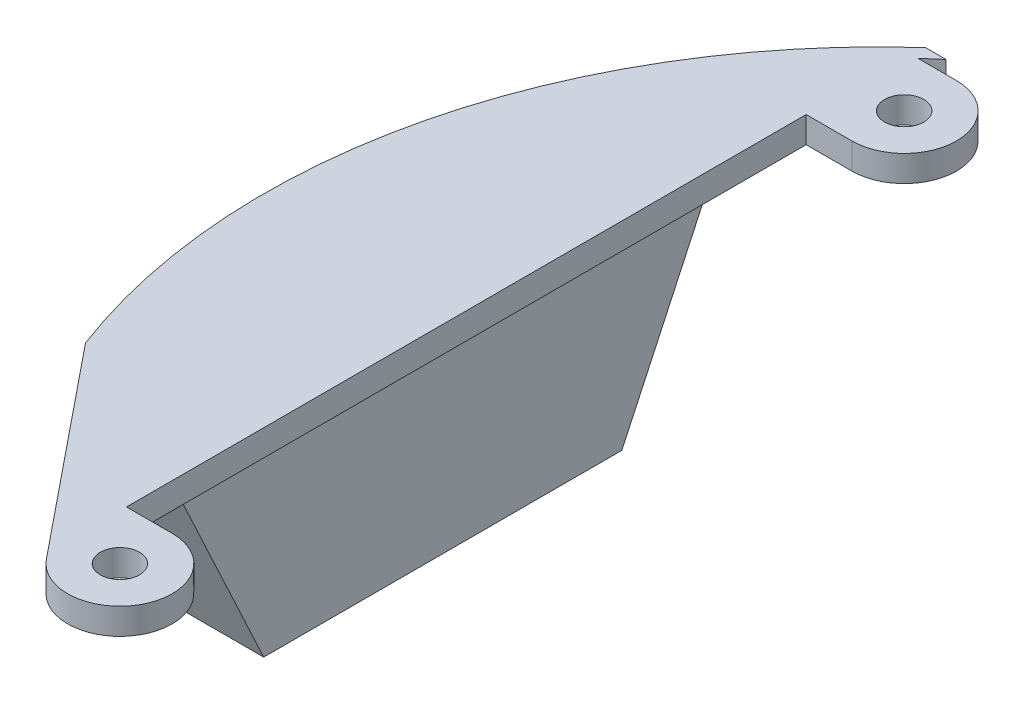
ISO-10303-21;
HEADER;
FILE_DESCRIPTION(('STEP AP214'),'2;1');
FILE_NAME('part.step','',(''),(''),'','','');
FILE_SCHEMA(('AUTOMOTIVE_DESIGN { 1 0 10303 214 1 1 1 1 }'));
ENDSEC;
DATA;
#1=APPLICATION_CONTEXT('core data for automotive mechanical design processes');
#2=APPLICATION_PROTOCOL_DEFINITION('international standard','automotive_design',2000,#1);
#3=PRODUCT_CONTEXT('',#1,'mechanical');
#4=PRODUCT('Part','Part','',(#3));
#5=PRODUCT_RELATED_PRODUCT_CATEGORY('part','',(#4));
#6=PRODUCT_DEFINITION_FORMATION('','',#4);
#7=PRODUCT_DEFINITION_CONTEXT('part definition',#1,'design');
#8=PRODUCT_DEFINITION('design','',#6,#7);
#9=PRODUCT_DEFINITION_SHAPE('','',#8);
#10=(LENGTH_UNIT() NAMED_UNIT(*) SI_UNIT(.MILLI.,.METRE.));
#11=(NAMED_UNIT(*) PLANE_ANGLE_UNIT() SI_UNIT($,.RADIAN.));
#12=(NAMED_UNIT(*) SI_UNIT($,.STERADIAN.) SOLID_ANGLE_UNIT());
#13=UNCERTAINTY_MEASURE_WITH_UNIT(LENGTH_MEASURE(1.E-05),#10,'distance_accuracy_value','');
#14=(GEOMETRIC_REPRESENTATION_CONTEXT(3) GLOBAL_UNCERTAINTY_ASSIGNED_CONTEXT((#13)) GLOBAL_UNIT_ASSIGNED_CONTEXT((#10,
#11,#12)) REPRESENTATION_CONTEXT('',''));
#15=CARTESIAN_POINT('',(0.,0.,0.));
#16=DIRECTION('',(0.,0.,1.));
#17=DIRECTION('',(1.,0.,0.));
#18=AXIS2_PLACEMENT_3D('',#15,#16,#17);
#19=CARTESIAN_POINT('',(0.,0.,0.));
#20=DIRECTION('',(0.,-1.,0.));
#21=DIRECTION('',(0.,0.,-1.));
#22=AXIS2_PLACEMENT_3D('',#19,#20,#21);
#23=PLANE('',#22);
#24=CARTESIAN_POINT('',(0.,0.,30.));
#25=DIRECTION('',(0.,1.,0.));
#26=DIRECTION('',(0.,0.,1.));
#27=AXIS2_PLACEMENT_3D('',#24,#25,#26);
#28=CIRCLE('',#27,1.5);
#29=CARTESIAN_POINT('',(0.,0.,31.5));
#30=VERTEX_POINT('',#29);
#31=EDGE_CURVE('E399',#30,#30,#28,.T.);
#32=ORIENTED_EDGE('',*,*,#31,.T.);
#33=EDGE_LOOP('',(#32));
#34=FACE_BOUND('',#33,.T.);
#35=CARTESIAN_POINT('',(0.,0.,-30.));
#36=DIRECTION('',(0.,1.,0.));
#37=DIRECTION('',(0.,0.,1.));
#38=AXIS2_PLACEMENT_3D('',#35,#36,#37);
#39=CIRCLE('',#38,1.5);
#40=CARTESIAN_POINT('',(0.,0.,-28.5));
#41=VERTEX_POINT('',#40);
#42=EDGE_CURVE('E406',#41,#41,#39,.T.);
#43=ORIENTED_EDGE('',*,*,#42,.T.);
#44=EDGE_LOOP('',(#43));
#45=FACE_BOUND('',#44,.T.);
#46=DIRECTION('',(0.629837318418098,0.,0.77672707711776));
#47=VECTOR('',#46,1.);
#48=CARTESIAN_POINT('',(-17.7832592903084,0.,14.4202007038354));
#49=LINE('',#48,#47);
#50=CARTESIAN_POINT('',(-12.6954230207267,0.,20.6946148723249));
#51=VERTEX_POINT('',#50);
#52=CARTESIAN_POINT('',(-3.10690830847104,0.,32.5193492736724));
#53=VERTEX_POINT('',#52);
#54=EDGE_CURVE('E334',#51,#53,#49,.T.);
#55=ORIENTED_EDGE('',*,*,#54,.F.);
#56=DIRECTION('',(1.,0.,0.));
#57=VECTOR('',#56,1.);
#58=CARTESIAN_POINT('',(0.,0.,20.6946148723249));
#59=LINE('',#58,#57);
#60=CARTESIAN_POINT('',(-5.29999999999982,0.,20.6946148723249));
#61=VERTEX_POINT('',#60);
#62=EDGE_CURVE('E315',#61,#51,#59,.F.);
#63=ORIENTED_EDGE('',*,*,#62,.F.);
#64=DIRECTION('',(0.,0.,0.999999999999988));
#65=VECTOR('',#64,1.);
#66=CARTESIAN_POINT('',(-5.29999999999982,0.,0.));
#67=LINE('',#66,#65);
#68=CARTESIAN_POINT('',(-5.29999999999982,0.,-20.6946148723248));
#69=VERTEX_POINT('',#68);
#70=EDGE_CURVE('E289',#69,#61,#67,.T.);
#71=ORIENTED_EDGE('',*,*,#70,.F.);
#72=DIRECTION('',(-1.,0.,0.));
#73=VECTOR('',#72,1.);
#74=CARTESIAN_POINT('',(0.,0.,-20.6946148723248));
#75=LINE('',#74,#73);
#76=CARTESIAN_POINT('',(-14.1987312046954,0.,-20.6946148723248));
#77=VERTEX_POINT('',#76);
#78=EDGE_CURVE('E318',#77,#69,#75,.F.);
#79=ORIENTED_EDGE('',*,*,#78,.F.);
#80=CARTESIAN_POINT('',(28.0000000000002,0.,0.));
#81=DIRECTION('',(0.,1.,0.));
#82=DIRECTION('',(0.,0.,1.));
#83=AXIS2_PLACEMENT_3D('',#80,#81,#82);
#84=CIRCLE('',#83,47.);
#85=CARTESIAN_POINT('',(-3.36877428271602,0.,-35.));
#86=VERTEX_POINT('',#85);
#87=EDGE_CURVE('E375',#86,#77,#84,.T.);
#88=ORIENTED_EDGE('',*,*,#87,.F.);
#89=DIRECTION('',(-1.,0.,0.));
#90=VECTOR('',#89,1.);
#91=CARTESIAN_POINT('',(-10.,0.,-35.));
#92=LINE('',#91,#90);
#93=CARTESIAN_POINT('',(-1.80181451100141,0.,-35.));
#94=VERTEX_POINT('',#93);
#95=EDGE_CURVE('E412',#94,#86,#92,.T.);
#96=ORIENTED_EDGE('',*,*,#95,.F.);
#97=CARTESIAN_POINT('',(28.0000000000002,0.,-0.129629629629611));
#98=DIRECTION('',(0.,1.,0.));
#99=DIRECTION('',(0.,0.,1.));
#100=AXIS2_PLACEMENT_3D('',#97,#98,#99);
#101=CIRCLE('',#100,45.8703703703704);
#102=CARTESIAN_POINT('',(-2.93362068832025,0.,-34.));
#103=VERTEX_POINT('',#102);
#104=EDGE_CURVE('E337',#94,#103,#101,.T.);
#105=ORIENTED_EDGE('',*,*,#104,.T.);
#106=DIRECTION('',(-1.,0.,0.));
#107=VECTOR('',#106,1.);
#108=CARTESIAN_POINT('',(0.,0.,-34.));
#109=LINE('',#108,#107);
#110=CARTESIAN_POINT('',(0.,0.,-34.));
#111=VERTEX_POINT('',#110);
#112=EDGE_CURVE('E340',#111,#103,#109,.T.);
#113=ORIENTED_EDGE('',*,*,#112,.F.);
#114=CARTESIAN_POINT('',(0.,0.,-30.));
#115=DIRECTION('',(0.,1.,0.));
#116=DIRECTION('',(0.,0.,1.));
#117=AXIS2_PLACEMENT_3D('',#114,#115,#116);
#118=CIRCLE('',#117,4.);
#119=CARTESIAN_POINT('',(0.,0.,-26.));
#120=VERTEX_POINT('',#119);
#121=EDGE_CURVE('E342',#120,#111,#118,.T.);
#122=ORIENTED_EDGE('',*,*,#121,.F.);
#123=DIRECTION('',(-1.,0.,0.));
#124=VECTOR('',#123,1.);
#125=CARTESIAN_POINT('',(-3.,0.,-26.));
#126=LINE('',#125,#124);
#127=CARTESIAN_POINT('',(-3.5,0.,-26.));
#128=VERTEX_POINT('',#127);
#129=EDGE_CURVE('E390',#120,#128,#126,.T.);
#130=ORIENTED_EDGE('',*,*,#129,.T.);
#131=DIRECTION('',(0.,0.,-1.));
#132=VECTOR('',#131,1.);
#133=CARTESIAN_POINT('',(-3.5,0.,0.));
#134=LINE('',#133,#132);
#135=CARTESIAN_POINT('',(-3.5,0.,26.));
#136=VERTEX_POINT('',#135);
#137=EDGE_CURVE('E381',#136,#128,#134,.T.);
#138=ORIENTED_EDGE('',*,*,#137,.F.);
#139=DIRECTION('',(1.,0.,0.));
#140=VECTOR('',#139,1.);
#141=CARTESIAN_POINT('',(-3.,0.,26.));
#142=LINE('',#141,#140);
#143=CARTESIAN_POINT('',(0.,0.,26.));
#144=VERTEX_POINT('',#143);
#145=EDGE_CURVE('E396',#136,#144,#142,.T.);
#146=ORIENTED_EDGE('',*,*,#145,.T.);
#147=CARTESIAN_POINT('',(0.,0.,30.));
#148=DIRECTION('',(0.,1.,0.));
#149=DIRECTION('',(0.,0.,1.));
#150=AXIS2_PLACEMENT_3D('',#147,#148,#149);
#151=CIRCLE('',#150,4.);
#152=EDGE_CURVE('E331',#144,#53,#151,.F.);
#153=ORIENTED_EDGE('',*,*,#152,.T.);
#154=EDGE_LOOP('',(#55,#63,#71,#79,#88,#96,#105,#113,#122,#130,#138,#146,#153));
#155=FACE_BOUND('',#154,.T.);
#156=ADVANCED_FACE('F128',(#34,#45,#155),#23,.T.);
#157=CARTESIAN_POINT('',(-16.6999999999987,0.,-14.5227407881584));
#158=VERTEX_POINT('',#157);
#159=CARTESIAN_POINT('',(-16.6999999999987,0.,14.5227407881585));
#160=VERTEX_POINT('',#159);
#161=EDGE_CURVE('E371',#158,#160,#84,.T.);
#162=ORIENTED_EDGE('',*,*,#161,.F.);
#163=DIRECTION('',(0.,0.,-0.999999999999988));
#164=VECTOR('',#163,1.);
#165=CARTESIAN_POINT('',(-16.6999999999998,0.,0.));
#166=LINE('',#165,#164);
#167=EDGE_CURVE('E316',#160,#158,#166,.T.);
#168=ORIENTED_EDGE('',*,*,#167,.F.);
#169=EDGE_LOOP('',(#162,#168));
#170=FACE_BOUND('',#169,.T.);
#171=ADVANCED_FACE('F460',(#170),#23,.T.);
#172=CARTESIAN_POINT('',(0.,2.,0.));
#173=DIRECTION('',(0.,-1.,0.));
#174=DIRECTION('',(0.,0.,-1.));
#175=AXIS2_PLACEMENT_3D('',#172,#173,#174);
#176=PLANE('',#175);
#177=CARTESIAN_POINT('',(0.,2.,-30.));
#178=DIRECTION('',(0.,1.,0.));
#179=DIRECTION('',(0.,0.,1.));
#180=AXIS2_PLACEMENT_3D('',#177,#178,#179);
#181=CIRCLE('',#180,1.5);
#182=CARTESIAN_POINT('',(0.,2.,-28.5));
#183=VERTEX_POINT('',#182);
#184=EDGE_CURVE('E409',#183,#183,#181,.T.);
#185=ORIENTED_EDGE('',*,*,#184,.F.);
#186=EDGE_LOOP('',(#185));
#187=FACE_BOUND('',#186,.T.);
#188=CARTESIAN_POINT('',(0.,2.,30.));
#189=DIRECTION('',(0.,1.,0.));
#190=DIRECTION('',(0.,0.,1.));
#191=AXIS2_PLACEMENT_3D('',#188,#189,#190);
#192=CIRCLE('',#191,1.5);
#193=CARTESIAN_POINT('',(0.,2.,31.5));
#194=VERTEX_POINT('',#193);
#195=EDGE_CURVE('E403',#194,#194,#192,.T.);
#196=ORIENTED_EDGE('',*,*,#195,.F.);
#197=EDGE_LOOP('',(#196));
#198=FACE_BOUND('',#197,.T.);
#199=CARTESIAN_POINT('',(28.0000000000002,2.,0.));
#200=DIRECTION('',(0.,1.,0.));
#201=DIRECTION('',(0.,0.,1.));
#202=AXIS2_PLACEMENT_3D('',#199,#200,#201);
#203=CIRCLE('',#202,47.);
#204=CARTESIAN_POINT('',(-3.36877428271602,2.,-35.));
#205=VERTEX_POINT('',#204);
#206=CARTESIAN_POINT('',(-15.9316189320438,2.,16.7036779785075));
#207=VERTEX_POINT('',#206);
#208=EDGE_CURVE('E361',#205,#207,#203,.T.);
#209=ORIENTED_EDGE('',*,*,#208,.T.);
#210=DIRECTION('',(0.629837318418098,0.,0.77672707711776));
#211=VECTOR('',#210,1.);
#212=CARTESIAN_POINT('',(-17.7832592903084,2.,14.4202007038354));
#213=LINE('',#212,#211);
#214=CARTESIAN_POINT('',(-3.10690830847104,2.,32.5193492736724));
#215=VERTEX_POINT('',#214);
#216=EDGE_CURVE('E347',#207,#215,#213,.T.);
#217=ORIENTED_EDGE('',*,*,#216,.T.);
#218=CARTESIAN_POINT('',(0.,2.,30.));
#219=DIRECTION('',(0.,1.,0.));
#220=DIRECTION('',(0.,0.,1.));
#221=AXIS2_PLACEMENT_3D('',#218,#219,#220);
#222=CIRCLE('',#221,4.);
#223=CARTESIAN_POINT('',(0.,2.,26.));
#224=VERTEX_POINT('',#223);
#225=EDGE_CURVE('E329',#224,#215,#222,.F.);
#226=ORIENTED_EDGE('',*,*,#225,.F.);
#227=DIRECTION('',(1.,0.,0.));
#228=VECTOR('',#227,1.);
#229=CARTESIAN_POINT('',(-3.,2.,26.));
#230=LINE('',#229,#228);
#231=CARTESIAN_POINT('',(-3.5,2.,26.));
#232=VERTEX_POINT('',#231);
#233=EDGE_CURVE('E395',#232,#224,#230,.T.);
#234=ORIENTED_EDGE('',*,*,#233,.F.);
#235=DIRECTION('',(0.,0.,-1.));
#236=VECTOR('',#235,1.);
#237=CARTESIAN_POINT('',(-3.5,2.,0.));
#238=LINE('',#237,#236);
#239=CARTESIAN_POINT('',(-3.5,2.,-26.));
#240=VERTEX_POINT('',#239);
#241=EDGE_CURVE('E380',#232,#240,#238,.T.);
#242=ORIENTED_EDGE('',*,*,#241,.T.);
#243=DIRECTION('',(-1.,0.,0.));
#244=VECTOR('',#243,1.);
#245=CARTESIAN_POINT('',(-3.,2.,-26.));
#246=LINE('',#245,#244);
#247=CARTESIAN_POINT('',(0.,2.,-26.));
#248=VERTEX_POINT('',#247);
#249=EDGE_CURVE('E393',#248,#240,#246,.T.);
#250=ORIENTED_EDGE('',*,*,#249,.F.);
#251=CARTESIAN_POINT('',(0.,2.,-30.));
#252=DIRECTION('',(0.,1.,0.));
#253=DIRECTION('',(0.,0.,1.));
#254=AXIS2_PLACEMENT_3D('',#251,#252,#253);
#255=CIRCLE('',#254,4.);
#256=CARTESIAN_POINT('',(0.,2.,-34.));
#257=VERTEX_POINT('',#256);
#258=EDGE_CURVE('E335',#248,#257,#255,.T.);
#259=ORIENTED_EDGE('',*,*,#258,.T.);
#260=DIRECTION('',(-1.,0.,0.));
#261=VECTOR('',#260,1.);
#262=CARTESIAN_POINT('',(0.,2.,-34.));
#263=LINE('',#262,#261);
#264=CARTESIAN_POINT('',(-2.93362068832025,2.,-34.));
#265=VERTEX_POINT('',#264);
#266=EDGE_CURVE('E353',#257,#265,#263,.T.);
#267=ORIENTED_EDGE('',*,*,#266,.T.);
#268=CARTESIAN_POINT('',(28.0000000000002,2.,-0.129629629629611));
#269=DIRECTION('',(0.,1.,0.));
#270=DIRECTION('',(0.,0.,1.));
#271=AXIS2_PLACEMENT_3D('',#268,#269,#270);
#272=CIRCLE('',#271,45.8703703703704);
#273=CARTESIAN_POINT('',(-1.80181451100141,2.,-35.));
#274=VERTEX_POINT('',#273);
#275=EDGE_CURVE('E350',#274,#265,#272,.T.);
#276=ORIENTED_EDGE('',*,*,#275,.F.);
#277=DIRECTION('',(-1.,0.,0.));
#278=VECTOR('',#277,1.);
#279=CARTESIAN_POINT('',(-10.,2.,-35.));
#280=LINE('',#279,#278);
#281=EDGE_CURVE('E415',#274,#205,#280,.T.);
#282=ORIENTED_EDGE('',*,*,#281,.T.);
#283=EDGE_LOOP('',(#209,#217,#226,#234,#242,#250,#259,#267,#276,#282));
#284=FACE_BOUND('',#283,.T.);
#285=ADVANCED_FACE('F467',(#187,#198,#284),#176,.F.);
#286=CARTESIAN_POINT('',(-10.,2.,-35.));
#287=DIRECTION('',(0.,0.,1.));
#288=DIRECTION('',(1.,0.,0.));
#289=AXIS2_PLACEMENT_3D('',#286,#287,#288);
#290=PLANE('',#289);
#291=DIRECTION('',(0.,1.,0.));
#292=VECTOR('',#291,1.);
#293=CARTESIAN_POINT('',(-3.36877428271602,0.,-35.));
#294=LINE('',#293,#292);
#295=EDGE_CURVE('E374',#86,#205,#294,.T.);
#296=ORIENTED_EDGE('',*,*,#295,.T.);
#297=ORIENTED_EDGE('',*,*,#281,.F.);
#298=DIRECTION('',(0.,1.,0.));
#299=VECTOR('',#298,1.);
#300=CARTESIAN_POINT('',(-1.80181451100141,0.,-35.));
#301=LINE('',#300,#299);
#302=EDGE_CURVE('E366',#94,#274,#301,.T.);
#303=ORIENTED_EDGE('',*,*,#302,.F.);
#304=ORIENTED_EDGE('',*,*,#95,.T.);
#305=EDGE_LOOP('',(#296,#297,#303,#304));
#306=FACE_BOUND('',#305,.T.);
#307=ADVANCED_FACE('F528',(#306),#290,.F.);
#308=CARTESIAN_POINT('',(-3.,2.,-26.));
#309=DIRECTION('',(0.,0.,1.));
#310=DIRECTION('',(1.,0.,0.));
#311=AXIS2_PLACEMENT_3D('',#308,#309,#310);
#312=PLANE('',#311);
#313=ORIENTED_EDGE('',*,*,#129,.F.);
#314=DIRECTION('',(0.,1.,0.));
#315=VECTOR('',#314,1.);
#316=CARTESIAN_POINT('',(0.,0.,-26.));
#317=LINE('',#316,#315);
#318=EDGE_CURVE('E358',#120,#248,#317,.T.);
#319=ORIENTED_EDGE('',*,*,#318,.T.);
#320=ORIENTED_EDGE('',*,*,#249,.T.);
#321=DIRECTION('',(0.,1.,0.));
#322=VECTOR('',#321,1.);
#323=CARTESIAN_POINT('',(-3.5,0.,-26.));
#324=LINE('',#323,#322);
#325=EDGE_CURVE('E384',#128,#240,#324,.T.);
#326=ORIENTED_EDGE('',*,*,#325,.F.);
#327=EDGE_LOOP('',(#313,#319,#320,#326));
#328=FACE_BOUND('',#327,.T.);
#329=ADVANCED_FACE('F524',(#328),#312,.T.);
#330=CARTESIAN_POINT('',(-3.,2.,26.));
#331=DIRECTION('',(0.,0.,-1.));
#332=DIRECTION('',(-1.,0.,0.));
#333=AXIS2_PLACEMENT_3D('',#330,#331,#332);
#334=PLANE('',#333);
#335=ORIENTED_EDGE('',*,*,#233,.T.);
#336=DIRECTION('',(0.,1.,0.));
#337=VECTOR('',#336,1.);
#338=CARTESIAN_POINT('',(0.,0.,26.));
#339=LINE('',#338,#337);
#340=EDGE_CURVE('E344',#144,#224,#339,.T.);
#341=ORIENTED_EDGE('',*,*,#340,.F.);
#342=ORIENTED_EDGE('',*,*,#145,.F.);
#343=DIRECTION('',(0.,1.,0.));
#344=VECTOR('',#343,1.);
#345=CARTESIAN_POINT('',(-3.5,0.,26.));
#346=LINE('',#345,#344);
#347=EDGE_CURVE('E387',#136,#232,#346,.T.);
#348=ORIENTED_EDGE('',*,*,#347,.T.);
#349=EDGE_LOOP('',(#335,#341,#342,#348));
#350=FACE_BOUND('',#349,.T.);
#351=ADVANCED_FACE('F520',(#350),#334,.T.);
#352=CARTESIAN_POINT('',(0.,2.,-30.));
#353=DIRECTION('',(0.,-1.,0.));
#354=DIRECTION('',(0.,0.,-1.));
#355=AXIS2_PLACEMENT_3D('',#352,#353,#354);
#356=CYLINDRICAL_SURFACE('',#355,1.5);
#357=ORIENTED_EDGE('',*,*,#184,.T.);
#358=EDGE_LOOP('',(#357));
#359=FACE_BOUND('',#358,.T.);
#360=ORIENTED_EDGE('',*,*,#42,.F.);
#361=EDGE_LOOP('',(#360));
#362=FACE_BOUND('',#361,.T.);
#363=ADVANCED_FACE('F523',(#359,#362),#356,.F.);
#364=CARTESIAN_POINT('',(0.,2.,30.));
#365=DIRECTION('',(0.,-1.,0.));
#366=DIRECTION('',(0.,0.,-1.));
#367=AXIS2_PLACEMENT_3D('',#364,#365,#366);
#368=CYLINDRICAL_SURFACE('',#367,1.5);
#369=ORIENTED_EDGE('',*,*,#195,.T.);
#370=EDGE_LOOP('',(#369));
#371=FACE_BOUND('',#370,.T.);
#372=ORIENTED_EDGE('',*,*,#31,.F.);
#373=EDGE_LOOP('',(#372));
#374=FACE_BOUND('',#373,.T.);
#375=ADVANCED_FACE('F518',(#371,#374),#368,.F.);
#376=CARTESIAN_POINT('',(-3.5,0.,0.));
#377=DIRECTION('',(1.,0.,0.));
#378=DIRECTION('',(0.,0.,-1.));
#379=AXIS2_PLACEMENT_3D('',#376,#377,#378);
#380=PLANE('',#379);
#381=ORIENTED_EDGE('',*,*,#241,.F.);
#382=ORIENTED_EDGE('',*,*,#347,.F.);
#383=ORIENTED_EDGE('',*,*,#137,.T.);
#384=ORIENTED_EDGE('',*,*,#325,.T.);
#385=EDGE_LOOP('',(#381,#382,#383,#384));
#386=FACE_BOUND('',#385,.T.);
#387=ADVANCED_FACE('F513',(#386),#380,.T.);
#388=CARTESIAN_POINT('',(0.,0.,30.));
#389=DIRECTION('',(0.,1.,0.));
#390=DIRECTION('',(0.,0.,1.));
#391=AXIS2_PLACEMENT_3D('',#388,#389,#390);
#392=CYLINDRICAL_SURFACE('',#391,4.);
#393=ORIENTED_EDGE('',*,*,#225,.T.);
#394=DIRECTION('',(0.,1.,0.));
#395=VECTOR('',#394,1.);
#396=CARTESIAN_POINT('',(-3.10690830847104,0.,32.5193492736724));
#397=LINE('',#396,#395);
#398=EDGE_CURVE('E368',#53,#215,#397,.T.);
#399=ORIENTED_EDGE('',*,*,#398,.F.);
#400=ORIENTED_EDGE('',*,*,#152,.F.);
#401=ORIENTED_EDGE('',*,*,#340,.T.);
#402=EDGE_LOOP('',(#393,#399,#400,#401));
#403=FACE_BOUND('',#402,.T.);
#404=ADVANCED_FACE('F510',(#403),#392,.T.);
#405=CARTESIAN_POINT('',(-17.7832592903084,0.,14.4202007038354));
#406=DIRECTION('',(-0.77672707711776,0.,0.629837318418098));
#407=DIRECTION('',(0.629837318418098,0.,0.77672707711776));
#408=AXIS2_PLACEMENT_3D('',#405,#406,#407);
#409=PLANE('',#408);
#410=ORIENTED_EDGE('',*,*,#216,.F.);
#411=DIRECTION('',(0.,1.,0.));
#412=VECTOR('',#411,1.);
#413=CARTESIAN_POINT('',(-15.9316189320438,0.,16.7036779785075));
#414=LINE('',#413,#412);
#415=CARTESIAN_POINT('',(-15.9316189320438,-8.55859178810817,16.7036779785075));
#416=VERTEX_POINT('',#415);
#417=EDGE_CURVE('E326',#416,#207,#414,.T.);
#418=ORIENTED_EDGE('',*,*,#417,.F.);
#419=DIRECTION('',(0.324187360010223,0.857360726366758,0.399793872506155));
#420=VECTOR('',#419,1.);
#421=CARTESIAN_POINT('',(-14.0433566350928,-3.56480691496023,19.032318108035));
#422=LINE('',#421,#420);
#423=EDGE_CURVE('E418',#51,#416,#422,.F.);
#424=ORIENTED_EDGE('',*,*,#423,.F.);
#425=ORIENTED_EDGE('',*,*,#54,.T.);
#426=ORIENTED_EDGE('',*,*,#398,.T.);
#427=EDGE_LOOP('',(#410,#418,#424,#425,#426));
#428=FACE_BOUND('',#427,.T.);
#429=ADVANCED_FACE('F500',(#428),#409,.T.);
#430=CARTESIAN_POINT('',(0.,0.,-30.));
#431=DIRECTION('',(0.,1.,0.));
#432=DIRECTION('',(0.,0.,1.));
#433=AXIS2_PLACEMENT_3D('',#430,#431,#432);
#434=CYLINDRICAL_SURFACE('',#433,4.);
#435=ORIENTED_EDGE('',*,*,#258,.F.);
#436=ORIENTED_EDGE('',*,*,#318,.F.);
#437=ORIENTED_EDGE('',*,*,#121,.T.);
#438=DIRECTION('',(0.,1.,0.));
#439=VECTOR('',#438,1.);
#440=CARTESIAN_POINT('',(0.,0.,-34.));
#441=LINE('',#440,#439);
#442=EDGE_CURVE('E362',#111,#257,#441,.T.);
#443=ORIENTED_EDGE('',*,*,#442,.T.);
#444=EDGE_LOOP('',(#435,#436,#437,#443));
#445=FACE_BOUND('',#444,.T.);
#446=ADVANCED_FACE('F496',(#445),#434,.T.);
#447=CARTESIAN_POINT('',(0.,0.,-34.));
#448=DIRECTION('',(0.,0.,-1.));
#449=DIRECTION('',(-1.,0.,0.));
#450=AXIS2_PLACEMENT_3D('',#447,#448,#449);
#451=PLANE('',#450);
#452=ORIENTED_EDGE('',*,*,#266,.F.);
#453=ORIENTED_EDGE('',*,*,#442,.F.);
#454=ORIENTED_EDGE('',*,*,#112,.T.);
#455=DIRECTION('',(0.,1.,0.));
#456=VECTOR('',#455,1.);
#457=CARTESIAN_POINT('',(-2.93362068832025,0.,-34.));
#458=LINE('',#457,#456);
#459=EDGE_CURVE('E364',#103,#265,#458,.T.);
#460=ORIENTED_EDGE('',*,*,#459,.T.);
#461=EDGE_LOOP('',(#452,#453,#454,#460));
#462=FACE_BOUND('',#461,.T.);
#463=ADVANCED_FACE('F499',(#462),#451,.T.);
#464=CARTESIAN_POINT('',(28.0000000000002,0.,-0.129629629629611));
#465=DIRECTION('',(0.,1.,0.));
#466=DIRECTION('',(0.,0.,1.));
#467=AXIS2_PLACEMENT_3D('',#464,#465,#466);
#468=CYLINDRICAL_SURFACE('',#467,45.8703703703704);
#469=ORIENTED_EDGE('',*,*,#275,.T.);
#470=ORIENTED_EDGE('',*,*,#459,.F.);
#471=ORIENTED_EDGE('',*,*,#104,.F.);
#472=ORIENTED_EDGE('',*,*,#302,.T.);
#473=EDGE_LOOP('',(#469,#470,#471,#472));
#474=FACE_BOUND('',#473,.T.);
#475=ADVANCED_FACE('F457',(#474),#468,.F.);
#476=CARTESIAN_POINT('',(28.0000000000002,0.,0.));
#477=DIRECTION('',(0.,1.,0.));
#478=DIRECTION('',(0.,0.,1.));
#479=AXIS2_PLACEMENT_3D('',#476,#477,#478);
#480=CYLINDRICAL_SURFACE('',#479,47.);
#481=ORIENTED_EDGE('',*,*,#208,.F.);
#482=ORIENTED_EDGE('',*,*,#295,.F.);
#483=ORIENTED_EDGE('',*,*,#87,.T.);
#484=CARTESIAN_POINT('',(28.0000000000002,-44.3797448109803,0.));
#485=DIRECTION('',(0.,-0.4226182617407,-0.906307787036644));
#486=DIRECTION('',(0.,0.906307787036649,-0.422618261740702));
#487=AXIS2_PLACEMENT_3D('',#484,#485,#486);
#488=ELLIPSE('',#487,111.211474408167,47.);
#489=CARTESIAN_POINT('',(-16.6999999999998,-13.2356266860101,-14.5227407881576));
#490=VERTEX_POINT('',#489);
#491=EDGE_CURVE('E136',#77,#490,#488,.F.);
#492=ORIENTED_EDGE('',*,*,#491,.T.);
#493=DIRECTION('',(0.,1.,0.));
#494=VECTOR('',#493,1.);
#495=CARTESIAN_POINT('',(-16.6999999999998,0.,-14.522740788157));
#496=LINE('',#495,#494);
#497=EDGE_CURVE('E12',#158,#490,#496,.F.);
#498=ORIENTED_EDGE('',*,*,#497,.F.);
#499=ORIENTED_EDGE('',*,*,#161,.T.);
#500=DIRECTION('',(0.,1.,0.));
#501=VECTOR('',#500,1.);
#502=CARTESIAN_POINT('',(-16.6999999999998,0.,14.522740788157));
#503=LINE('',#502,#501);
#504=CARTESIAN_POINT('',(-16.6999999999998,-13.2356266860114,14.522740788157));
#505=VERTEX_POINT('',#504);
#506=EDGE_CURVE('E435',#160,#505,#503,.F.);
#507=ORIENTED_EDGE('',*,*,#506,.T.);
#508=CARTESIAN_POINT('',(28.0000000000002,-44.3797448109803,0.));
#509=DIRECTION('',(0.,-0.4226182617407,0.906307787036644));
#510=DIRECTION('',(0.,0.906307787036649,0.422618261740702));
#511=AXIS2_PLACEMENT_3D('',#508,#509,#510);
#512=ELLIPSE('',#511,111.211474408167,47.);
#513=EDGE_CURVE('E149',#416,#505,#512,.T.);
#514=ORIENTED_EDGE('',*,*,#513,.F.);
#515=ORIENTED_EDGE('',*,*,#417,.T.);
#516=EDGE_LOOP('',(#481,#482,#483,#492,#498,#499,#507,#514,#515));
#517=FACE_BOUND('',#516,.T.);
#518=ADVANCED_FACE('F439',(#517),#480,.T.);
#519=CARTESIAN_POINT('',(0.,-15.,13.6999999999998));
#520=DIRECTION('',(0.,-0.4226182617407,0.906307787036644));
#521=DIRECTION('',(0.,-0.906307787036649,-0.422618261740702));
#522=AXIS2_PLACEMENT_3D('',#519,#520,#521);
#523=PLANE('',#522);
#524=ORIENTED_EDGE('',*,*,#513,.T.);
#525=DIRECTION('',(0.,-0.906307787036649,-0.422618261740702));
#526=VECTOR('',#525,1.);
#527=CARTESIAN_POINT('',(-16.6999999999998,-20.247404435365,11.2530951263526));
#528=LINE('',#527,#526);
#529=CARTESIAN_POINT('',(-16.6999999999998,-15.,13.6999999999998));
#530=VERTEX_POINT('',#529);
#531=EDGE_CURVE('E330',#530,#505,#528,.F.);
#532=ORIENTED_EDGE('',*,*,#531,.F.);
#533=DIRECTION('',(-0.999999999999994,0.,0.));
#534=VECTOR('',#533,1.);
#535=CARTESIAN_POINT('',(0.,-15.,13.6999999999998));
#536=LINE('',#535,#534);
#537=CARTESIAN_POINT('',(-5.29999999999999,-15.,13.6999999999999));
#538=VERTEX_POINT('',#537);
#539=EDGE_CURVE('E298',#538,#530,#536,.T.);
#540=ORIENTED_EDGE('',*,*,#539,.F.);
#541=DIRECTION('',(0.,-0.906307787036649,-0.422618261740702));
#542=VECTOR('',#541,1.);
#543=CARTESIAN_POINT('',(-5.29999999999982,-15.,13.6999999999998));
#544=LINE('',#543,#542);
#545=EDGE_CURVE('E277',#538,#61,#544,.F.);
#546=ORIENTED_EDGE('',*,*,#545,.T.);
#547=ORIENTED_EDGE('',*,*,#62,.T.);
#548=ORIENTED_EDGE('',*,*,#423,.T.);
#549=EDGE_LOOP('',(#524,#532,#540,#546,#547,#548));
#550=FACE_BOUND('',#549,.T.);
#551=ADVANCED_FACE('F130',(#550),#523,.T.);
#552=CARTESIAN_POINT('',(-16.6999999999998,-15.,0.));
#553=DIRECTION('',(1.,0.,0.));
#554=DIRECTION('',(0.,0.,-1.));
#555=AXIS2_PLACEMENT_3D('',#552,#553,#554);
#556=PLANE('',#555);
#557=ORIENTED_EDGE('',*,*,#167,.T.);
#558=ORIENTED_EDGE('',*,*,#497,.T.);
#559=DIRECTION('',(0.,-0.906307787036649,0.422618261740702));
#560=VECTOR('',#559,1.);
#561=CARTESIAN_POINT('',(-16.6999999999998,-15.,-13.6999999999998));
#562=LINE('',#561,#560);
#563=CARTESIAN_POINT('',(-16.6999999999998,-15.,-13.6999999999998));
#564=VERTEX_POINT('',#563);
#565=EDGE_CURVE('E423',#564,#490,#562,.F.);
#566=ORIENTED_EDGE('',*,*,#565,.F.);
#567=DIRECTION('',(0.,0.,-0.999999999999988));
#568=VECTOR('',#567,1.);
#569=CARTESIAN_POINT('',(-16.6999999999998,-15.,0.));
#570=LINE('',#569,#568);
#571=EDGE_CURVE('E301',#530,#564,#570,.T.);
#572=ORIENTED_EDGE('',*,*,#571,.F.);
#573=ORIENTED_EDGE('',*,*,#531,.T.);
#574=ORIENTED_EDGE('',*,*,#506,.F.);
#575=EDGE_LOOP('',(#557,#558,#566,#572,#573,#574));
#576=FACE_BOUND('',#575,.T.);
#577=ADVANCED_FACE('F446',(#576),#556,.F.);
#578=CARTESIAN_POINT('',(0.,-15.,-13.6999999999998));
#579=DIRECTION('',(0.,-0.4226182617407,-0.906307787036644));
#580=DIRECTION('',(0.,0.906307787036649,-0.422618261740702));
#581=AXIS2_PLACEMENT_3D('',#578,#579,#580);
#582=PLANE('',#581);
#583=ORIENTED_EDGE('',*,*,#78,.T.);
#584=DIRECTION('',(0.,-0.906307787036649,0.422618261740702));
#585=VECTOR('',#584,1.);
#586=CARTESIAN_POINT('',(-5.29999999999982,-20.2474044353649,-11.2530951263526));
#587=LINE('',#586,#585);
#588=CARTESIAN_POINT('',(-5.29999999999982,-15.,-13.6999999999997));
#589=VERTEX_POINT('',#588);
#590=EDGE_CURVE('E426',#589,#69,#587,.F.);
#591=ORIENTED_EDGE('',*,*,#590,.F.);
#592=DIRECTION('',(0.999999999999994,0.,0.));
#593=VECTOR('',#592,1.);
#594=CARTESIAN_POINT('',(0.,-15.,-13.6999999999998));
#595=LINE('',#594,#593);
#596=EDGE_CURVE('E303',#564,#589,#595,.T.);
#597=ORIENTED_EDGE('',*,*,#596,.F.);
#598=ORIENTED_EDGE('',*,*,#565,.T.);
#599=ORIENTED_EDGE('',*,*,#491,.F.);
#600=EDGE_LOOP('',(#583,#591,#597,#598,#599));
#601=FACE_BOUND('',#600,.T.);
#602=ADVANCED_FACE('F444',(#601),#582,.T.);
#603=CARTESIAN_POINT('',(0.,-15.,12.4999999999998));
#604=DIRECTION('',(0.,0.,-1.));
#605=DIRECTION('',(-1.,0.,0.));
#606=AXIS2_PLACEMENT_3D('',#603,#604,#605);
#607=PLANE('',#606);
#608=DIRECTION('',(-0.999999999999994,0.,0.));
#609=VECTOR('',#608,1.);
#610=CARTESIAN_POINT('',(0.,0.,12.4999999999998));
#611=LINE('',#610,#609);
#612=CARTESIAN_POINT('',(-6.49999999999982,0.,12.4999999999999));
#613=VERTEX_POINT('',#612);
#614=CARTESIAN_POINT('',(-15.5,0.,12.4999999999998));
#615=VERTEX_POINT('',#614);
#616=EDGE_CURVE('E273',#613,#615,#611,.T.);
#617=ORIENTED_EDGE('',*,*,#616,.F.);
#618=DIRECTION('',(0.,1.,0.));
#619=VECTOR('',#618,1.);
#620=CARTESIAN_POINT('',(-6.5,-15.,12.4999999999999));
#621=LINE('',#620,#619);
#622=CARTESIAN_POINT('',(-6.5,-15.,12.4999999999999));
#623=VERTEX_POINT('',#622);
#624=EDGE_CURVE('E267',#623,#613,#621,.T.);
#625=ORIENTED_EDGE('',*,*,#624,.F.);
#626=DIRECTION('',(-0.999999999999994,0.,0.));
#627=VECTOR('',#626,1.);
#628=CARTESIAN_POINT('',(0.,-15.,12.4999999999998));
#629=LINE('',#628,#627);
#630=CARTESIAN_POINT('',(-15.5,-15.,12.4999999999998));
#631=VERTEX_POINT('',#630);
#632=EDGE_CURVE('E271',#623,#631,#629,.T.);
#633=ORIENTED_EDGE('',*,*,#632,.T.);
#634=DIRECTION('',(0.,1.,0.));
#635=VECTOR('',#634,1.);
#636=CARTESIAN_POINT('',(-15.5,-15.,12.4999999999998));
#637=LINE('',#636,#635);
#638=EDGE_CURVE('E307',#631,#615,#637,.T.);
#639=ORIENTED_EDGE('',*,*,#638,.T.);
#640=EDGE_LOOP('',(#617,#625,#633,#639));
#641=FACE_BOUND('',#640,.T.);
#642=ADVANCED_FACE('F269',(#641),#607,.T.);
#643=CARTESIAN_POINT('',(-6.49999999999982,-15.,0.));
#644=DIRECTION('',(-1.,0.,0.));
#645=DIRECTION('',(0.,0.,1.));
#646=AXIS2_PLACEMENT_3D('',#643,#644,#645);
#647=PLANE('',#646);
#648=DIRECTION('',(0.,0.,0.999999999999988));
#649=VECTOR('',#648,1.);
#650=CARTESIAN_POINT('',(-6.49999999999982,0.,0.));
#651=LINE('',#650,#649);
#652=CARTESIAN_POINT('',(-6.49999999999982,0.,-12.4999999999998));
#653=VERTEX_POINT('',#652);
#654=EDGE_CURVE('E309',#653,#613,#651,.T.);
#655=ORIENTED_EDGE('',*,*,#654,.F.);
#656=DIRECTION('',(0.,1.,0.));
#657=VECTOR('',#656,1.);
#658=CARTESIAN_POINT('',(-6.49999999999982,-15.,-12.4999999999997));
#659=LINE('',#658,#657);
#660=CARTESIAN_POINT('',(-6.49999999999982,-15.,-12.4999999999997));
#661=VERTEX_POINT('',#660);
#662=EDGE_CURVE('E278',#661,#653,#659,.T.);
#663=ORIENTED_EDGE('',*,*,#662,.F.);
#664=DIRECTION('',(0.,0.,0.999999999999988));
#665=VECTOR('',#664,1.);
#666=CARTESIAN_POINT('',(-6.49999999999982,-15.,0.));
#667=LINE('',#666,#665);
#668=EDGE_CURVE('E285',#661,#623,#667,.T.);
#669=ORIENTED_EDGE('',*,*,#668,.T.);
#670=ORIENTED_EDGE('',*,*,#624,.T.);
#671=EDGE_LOOP('',(#655,#663,#669,#670));
#672=FACE_BOUND('',#671,.T.);
#673=ADVANCED_FACE('F291',(#672),#647,.T.);
#674=CARTESIAN_POINT('',(0.,-15.,-12.4999999999998));
#675=DIRECTION('',(0.,0.,1.));
#676=DIRECTION('',(1.,0.,0.));
#677=AXIS2_PLACEMENT_3D('',#674,#675,#676);
#678=PLANE('',#677);
#679=DIRECTION('',(0.999999999999994,0.,0.));
#680=VECTOR('',#679,1.);
#681=CARTESIAN_POINT('',(0.,0.,-12.4999999999998));
#682=LINE('',#681,#680);
#683=CARTESIAN_POINT('',(-15.4999999999998,0.,-12.4999999999998));
#684=VERTEX_POINT('',#683);
#685=EDGE_CURVE('E311',#684,#653,#682,.T.);
#686=ORIENTED_EDGE('',*,*,#685,.F.);
#687=DIRECTION('',(0.,1.,0.));
#688=VECTOR('',#687,1.);
#689=CARTESIAN_POINT('',(-15.4999999999998,-15.,-12.4999999999998));
#690=LINE('',#689,#688);
#691=CARTESIAN_POINT('',(-15.4999999999998,-15.,-12.4999999999998));
#692=VERTEX_POINT('',#691);
#693=EDGE_CURVE('E322',#692,#684,#690,.T.);
#694=ORIENTED_EDGE('',*,*,#693,.F.);
#695=DIRECTION('',(0.999999999999994,0.,0.));
#696=VECTOR('',#695,1.);
#697=CARTESIAN_POINT('',(0.,-15.,-12.4999999999998));
#698=LINE('',#697,#696);
#699=EDGE_CURVE('E293',#692,#661,#698,.T.);
#700=ORIENTED_EDGE('',*,*,#699,.T.);
#701=ORIENTED_EDGE('',*,*,#662,.T.);
#702=EDGE_LOOP('',(#686,#694,#700,#701));
#703=FACE_BOUND('',#702,.T.);
#704=ADVANCED_FACE('F484',(#703),#678,.T.);
#705=CARTESIAN_POINT('',(-15.4999999999998,-15.,0.));
#706=DIRECTION('',(1.,0.,0.));
#707=DIRECTION('',(0.,0.,-1.));
#708=AXIS2_PLACEMENT_3D('',#705,#706,#707);
#709=PLANE('',#708);
#710=DIRECTION('',(0.,0.,-0.999999999999988));
#711=VECTOR('',#710,1.);
#712=CARTESIAN_POINT('',(-15.4999999999998,0.,0.));
#713=LINE('',#712,#711);
#714=EDGE_CURVE('E313',#615,#684,#713,.T.);
#715=ORIENTED_EDGE('',*,*,#714,.F.);
#716=ORIENTED_EDGE('',*,*,#638,.F.);
#717=DIRECTION('',(0.,0.,-0.999999999999988));
#718=VECTOR('',#717,1.);
#719=CARTESIAN_POINT('',(-15.4999999999998,-15.,0.));
#720=LINE('',#719,#718);
#721=EDGE_CURVE('E288',#631,#692,#720,.T.);
#722=ORIENTED_EDGE('',*,*,#721,.T.);
#723=ORIENTED_EDGE('',*,*,#693,.T.);
#724=EDGE_LOOP('',(#715,#716,#722,#723));
#725=FACE_BOUND('',#724,.T.);
#726=ADVANCED_FACE('F481',(#725),#709,.T.);
#727=CARTESIAN_POINT('',(-5.29999999999982,-15.,0.));
#728=DIRECTION('',(-1.,0.,0.));
#729=DIRECTION('',(0.,0.,1.));
#730=AXIS2_PLACEMENT_3D('',#727,#728,#729);
#731=PLANE('',#730);
#732=ORIENTED_EDGE('',*,*,#70,.T.);
#733=ORIENTED_EDGE('',*,*,#545,.F.);
#734=DIRECTION('',(0.,0.,0.999999999999988));
#735=VECTOR('',#734,1.);
#736=CARTESIAN_POINT('',(-5.29999999999982,-15.,0.));
#737=LINE('',#736,#735);
#738=EDGE_CURVE('E305',#589,#538,#737,.T.);
#739=ORIENTED_EDGE('',*,*,#738,.F.);
#740=ORIENTED_EDGE('',*,*,#590,.T.);
#741=EDGE_LOOP('',(#732,#733,#739,#740));
#742=FACE_BOUND('',#741,.T.);
#743=ADVANCED_FACE('F477',(#742),#731,.F.);
#744=CARTESIAN_POINT('',(0.,-15.,0.));
#745=DIRECTION('',(0.,-0.999999999999994,0.));
#746=DIRECTION('',(0.,0.,-0.999999999999988));
#747=AXIS2_PLACEMENT_3D('',#744,#745,#746);
#748=PLANE('',#747);
#749=ORIENTED_EDGE('',*,*,#632,.F.);
#750=ORIENTED_EDGE('',*,*,#668,.F.);
#751=ORIENTED_EDGE('',*,*,#699,.F.);
#752=ORIENTED_EDGE('',*,*,#721,.F.);
#753=EDGE_LOOP('',(#749,#750,#751,#752));
#754=FACE_BOUND('',#753,.T.);
#755=ORIENTED_EDGE('',*,*,#539,.T.);
#756=ORIENTED_EDGE('',*,*,#571,.T.);
#757=ORIENTED_EDGE('',*,*,#596,.T.);
#758=ORIENTED_EDGE('',*,*,#738,.T.);
#759=EDGE_LOOP('',(#755,#756,#757,#758));
#760=FACE_BOUND('',#759,.T.);
#761=ADVANCED_FACE('F282',(#754,#760),#748,.T.);
#762=ORIENTED_EDGE('',*,*,#616,.T.);
#763=ORIENTED_EDGE('',*,*,#714,.T.);
#764=ORIENTED_EDGE('',*,*,#685,.T.);
#765=ORIENTED_EDGE('',*,*,#654,.T.);
#766=EDGE_LOOP('',(#762,#763,#764,#765));
#767=FACE_BOUND('',#766,.T.);
#768=ADVANCED_FACE('F463',(#767),#23,.T.);
#769=CLOSED_SHELL('',(#156,#171,#285,#307,#329,#351,#363,#375,#387,#404,#429,#446,#463,#475,
#518,#551,#577,#602,#642,#673,#704,#726,#743,#761,#768));
#770=MANIFOLD_SOLID_BREP('B2',#769);
#771=ADVANCED_BREP_SHAPE_REPRESENTATION('',(#18,#770),#14);
#772=SHAPE_DEFINITION_REPRESENTATION(#9,#771);
ENDSEC;
END-ISO-10303-21;
